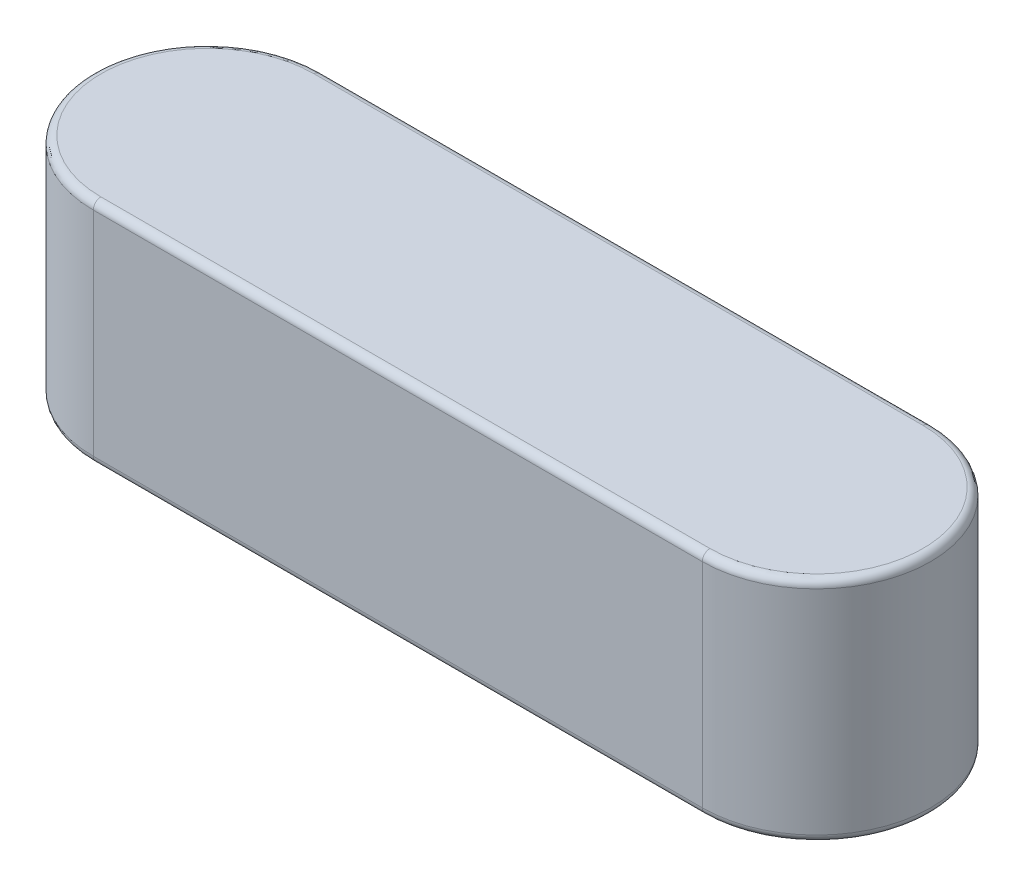
ISO-10303-21;
HEADER;
FILE_DESCRIPTION(('STEP AP214'),'2;1');
FILE_NAME('part.step','',(''),(''),'','','');
FILE_SCHEMA(('AUTOMOTIVE_DESIGN { 1 0 10303 214 1 1 1 1 }'));
ENDSEC;
DATA;
#1=APPLICATION_CONTEXT('core data for automotive mechanical design processes');
#2=APPLICATION_PROTOCOL_DEFINITION('international standard','automotive_design',2000,#1);
#3=PRODUCT_CONTEXT('',#1,'mechanical');
#4=PRODUCT('Part','Part','',(#3));
#5=PRODUCT_RELATED_PRODUCT_CATEGORY('part','',(#4));
#6=PRODUCT_DEFINITION_FORMATION('','',#4);
#7=PRODUCT_DEFINITION_CONTEXT('part definition',#1,'design');
#8=PRODUCT_DEFINITION('design','',#6,#7);
#9=PRODUCT_DEFINITION_SHAPE('','',#8);
#10=(LENGTH_UNIT() NAMED_UNIT(*) SI_UNIT(.MILLI.,.METRE.));
#11=(NAMED_UNIT(*) PLANE_ANGLE_UNIT() SI_UNIT($,.RADIAN.));
#12=(NAMED_UNIT(*) SI_UNIT($,.STERADIAN.) SOLID_ANGLE_UNIT());
#13=UNCERTAINTY_MEASURE_WITH_UNIT(LENGTH_MEASURE(1.E-05),#10,'distance_accuracy_value','');
#14=(GEOMETRIC_REPRESENTATION_CONTEXT(3) GLOBAL_UNCERTAINTY_ASSIGNED_CONTEXT((#13)) GLOBAL_UNIT_ASSIGNED_CONTEXT((#10,
#11,#12)) REPRESENTATION_CONTEXT('',''));
#15=CARTESIAN_POINT('',(0.,0.,0.));
#16=DIRECTION('',(0.,0.,1.));
#17=DIRECTION('',(1.,0.,0.));
#18=AXIS2_PLACEMENT_3D('',#15,#16,#17);
#19=CARTESIAN_POINT('',(0.,6.,0.));
#20=DIRECTION('',(0.,-1.,0.));
#21=DIRECTION('',(0.,0.,-1.));
#22=AXIS2_PLACEMENT_3D('',#19,#20,#21);
#23=CYLINDRICAL_SURFACE('',#22,3.);
#24=DIRECTION('',(0.,-1.,0.));
#25=VECTOR('',#24,1.);
#26=CARTESIAN_POINT('',(0.,6.,3.));
#27=LINE('',#26,#25);
#28=CARTESIAN_POINT('',(0.,5.8,3.));
#29=VERTEX_POINT('',#28);
#30=CARTESIAN_POINT('',(0.,0.2,3.));
#31=VERTEX_POINT('',#30);
#32=EDGE_CURVE('E130',#29,#31,#27,.T.);
#33=ORIENTED_EDGE('',*,*,#32,.F.);
#34=CARTESIAN_POINT('',(0.,5.8,0.));
#35=DIRECTION('',(0.,1.,0.));
#36=DIRECTION('',(0.,0.,1.));
#37=AXIS2_PLACEMENT_3D('',#34,#35,#36);
#38=CIRCLE('',#37,3.);
#39=CARTESIAN_POINT('',(0.,5.8,-3.));
#40=VERTEX_POINT('',#39);
#41=EDGE_CURVE('E115',#29,#40,#38,.F.);
#42=ORIENTED_EDGE('',*,*,#41,.T.);
#43=DIRECTION('',(0.,-1.,0.));
#44=VECTOR('',#43,1.);
#45=CARTESIAN_POINT('',(0.,6.,-3.));
#46=LINE('',#45,#44);
#47=CARTESIAN_POINT('',(0.,0.2,-3.));
#48=VERTEX_POINT('',#47);
#49=EDGE_CURVE('E181',#40,#48,#46,.T.);
#50=ORIENTED_EDGE('',*,*,#49,.T.);
#51=CARTESIAN_POINT('',(0.,0.2,0.));
#52=DIRECTION('',(0.,1.,0.));
#53=DIRECTION('',(0.,0.,1.));
#54=AXIS2_PLACEMENT_3D('',#51,#52,#53);
#55=CIRCLE('',#54,3.);
#56=EDGE_CURVE('E137',#48,#31,#55,.T.);
#57=ORIENTED_EDGE('',*,*,#56,.T.);
#58=EDGE_LOOP('',(#33,#42,#50,#57));
#59=FACE_BOUND('',#58,.T.);
#60=ADVANCED_FACE('F39',(#59),#23,.T.);
#61=CARTESIAN_POINT('',(0.,6.,3.));
#62=DIRECTION('',(0.,0.,-1.));
#63=DIRECTION('',(-1.,0.,0.));
#64=AXIS2_PLACEMENT_3D('',#61,#62,#63);
#65=PLANE('',#64);
#66=DIRECTION('',(0.,-1.,0.));
#67=VECTOR('',#66,1.);
#68=CARTESIAN_POINT('',(16.,6.,3.));
#69=LINE('',#68,#67);
#70=CARTESIAN_POINT('',(16.,5.8,3.));
#71=VERTEX_POINT('',#70);
#72=CARTESIAN_POINT('',(16.,0.2,3.));
#73=VERTEX_POINT('',#72);
#74=EDGE_CURVE('E215',#71,#73,#69,.T.);
#75=ORIENTED_EDGE('',*,*,#74,.F.);
#76=DIRECTION('',(1.,0.,0.));
#77=VECTOR('',#76,1.);
#78=CARTESIAN_POINT('',(0.,5.8,3.));
#79=LINE('',#78,#77);
#80=EDGE_CURVE('E11',#71,#29,#79,.F.);
#81=ORIENTED_EDGE('',*,*,#80,.T.);
#82=ORIENTED_EDGE('',*,*,#32,.T.);
#83=DIRECTION('',(1.,0.,0.));
#84=VECTOR('',#83,1.);
#85=CARTESIAN_POINT('',(0.,0.2,3.));
#86=LINE('',#85,#84);
#87=EDGE_CURVE('E49',#31,#73,#86,.T.);
#88=ORIENTED_EDGE('',*,*,#87,.T.);
#89=EDGE_LOOP('',(#75,#81,#82,#88));
#90=FACE_BOUND('',#89,.T.);
#91=ADVANCED_FACE('F213',(#90),#65,.F.);
#92=CARTESIAN_POINT('',(16.,6.,0.));
#93=DIRECTION('',(0.,-1.,0.));
#94=DIRECTION('',(0.,0.,-1.));
#95=AXIS2_PLACEMENT_3D('',#92,#93,#94);
#96=CYLINDRICAL_SURFACE('',#95,3.);
#97=DIRECTION('',(0.,-1.,0.));
#98=VECTOR('',#97,1.);
#99=CARTESIAN_POINT('',(16.,6.,-3.));
#100=LINE('',#99,#98);
#101=CARTESIAN_POINT('',(16.,5.8,-3.));
#102=VERTEX_POINT('',#101);
#103=CARTESIAN_POINT('',(16.,0.2,-3.));
#104=VERTEX_POINT('',#103);
#105=EDGE_CURVE('E218',#102,#104,#100,.T.);
#106=ORIENTED_EDGE('',*,*,#105,.F.);
#107=CARTESIAN_POINT('',(16.,5.8,0.));
#108=DIRECTION('',(0.,1.,0.));
#109=DIRECTION('',(0.,0.,1.));
#110=AXIS2_PLACEMENT_3D('',#107,#108,#109);
#111=CIRCLE('',#110,3.);
#112=EDGE_CURVE('E157',#102,#71,#111,.F.);
#113=ORIENTED_EDGE('',*,*,#112,.T.);
#114=ORIENTED_EDGE('',*,*,#74,.T.);
#115=CARTESIAN_POINT('',(16.,0.2,0.));
#116=DIRECTION('',(0.,1.,0.));
#117=DIRECTION('',(0.,0.,1.));
#118=AXIS2_PLACEMENT_3D('',#115,#116,#117);
#119=CIRCLE('',#118,3.);
#120=EDGE_CURVE('E154',#73,#104,#119,.T.);
#121=ORIENTED_EDGE('',*,*,#120,.T.);
#122=EDGE_LOOP('',(#106,#113,#114,#121));
#123=FACE_BOUND('',#122,.T.);
#124=ADVANCED_FACE('F237',(#123),#96,.T.);
#125=CARTESIAN_POINT('',(0.,6.,-3.));
#126=DIRECTION('',(0.,0.,1.));
#127=DIRECTION('',(1.,0.,0.));
#128=AXIS2_PLACEMENT_3D('',#125,#126,#127);
#129=PLANE('',#128);
#130=ORIENTED_EDGE('',*,*,#49,.F.);
#131=DIRECTION('',(-1.,0.,0.));
#132=VECTOR('',#131,1.);
#133=CARTESIAN_POINT('',(16.,5.8,-3.));
#134=LINE('',#133,#132);
#135=EDGE_CURVE('E151',#40,#102,#134,.F.);
#136=ORIENTED_EDGE('',*,*,#135,.T.);
#137=ORIENTED_EDGE('',*,*,#105,.T.);
#138=DIRECTION('',(-1.,0.,0.));
#139=VECTOR('',#138,1.);
#140=CARTESIAN_POINT('',(0.,0.2,-3.));
#141=LINE('',#140,#139);
#142=EDGE_CURVE('E148',#104,#48,#141,.T.);
#143=ORIENTED_EDGE('',*,*,#142,.T.);
#144=EDGE_LOOP('',(#130,#136,#137,#143));
#145=FACE_BOUND('',#144,.T.);
#146=ADVANCED_FACE('F232',(#145),#129,.F.);
#147=CARTESIAN_POINT('',(0.,6.,0.));
#148=DIRECTION('',(0.,1.,0.));
#149=DIRECTION('',(0.,0.,1.));
#150=AXIS2_PLACEMENT_3D('',#147,#148,#149);
#151=PLANE('',#150);
#152=DIRECTION('',(-1.,0.,0.));
#153=VECTOR('',#152,1.);
#154=CARTESIAN_POINT('',(0.,6.,-2.8));
#155=LINE('',#154,#153);
#156=CARTESIAN_POINT('',(16.,6.,-2.8));
#157=VERTEX_POINT('',#156);
#158=CARTESIAN_POINT('',(0.,6.,-2.8));
#159=VERTEX_POINT('',#158);
#160=EDGE_CURVE('E134',#157,#159,#155,.T.);
#161=ORIENTED_EDGE('',*,*,#160,.T.);
#162=CARTESIAN_POINT('',(0.,6.,0.));
#163=DIRECTION('',(0.,1.,0.));
#164=DIRECTION('',(0.,0.,1.));
#165=AXIS2_PLACEMENT_3D('',#162,#163,#164);
#166=CIRCLE('',#165,2.8);
#167=CARTESIAN_POINT('',(0.,6.,2.8));
#168=VERTEX_POINT('',#167);
#169=EDGE_CURVE('E113',#159,#168,#166,.T.);
#170=ORIENTED_EDGE('',*,*,#169,.T.);
#171=DIRECTION('',(1.,0.,0.));
#172=VECTOR('',#171,1.);
#173=CARTESIAN_POINT('',(16.,6.,2.8));
#174=LINE('',#173,#172);
#175=CARTESIAN_POINT('',(16.,6.,2.8));
#176=VERTEX_POINT('',#175);
#177=EDGE_CURVE('E122',#168,#176,#174,.T.);
#178=ORIENTED_EDGE('',*,*,#177,.T.);
#179=CARTESIAN_POINT('',(16.,6.,0.));
#180=DIRECTION('',(0.,1.,0.));
#181=DIRECTION('',(0.,0.,1.));
#182=AXIS2_PLACEMENT_3D('',#179,#180,#181);
#183=CIRCLE('',#182,2.8);
#184=EDGE_CURVE('E129',#176,#157,#183,.T.);
#185=ORIENTED_EDGE('',*,*,#184,.T.);
#186=EDGE_LOOP('',(#161,#170,#178,#185));
#187=FACE_BOUND('',#186,.T.);
#188=ADVANCED_FACE('F132',(#187),#151,.T.);
#189=CARTESIAN_POINT('',(0.,0.,0.));
#190=DIRECTION('',(0.,1.,0.));
#191=DIRECTION('',(0.,0.,1.));
#192=AXIS2_PLACEMENT_3D('',#189,#190,#191);
#193=PLANE('',#192);
#194=DIRECTION('',(1.,0.,0.));
#195=VECTOR('',#194,1.);
#196=CARTESIAN_POINT('',(0.,0.,2.8));
#197=LINE('',#196,#195);
#198=CARTESIAN_POINT('',(16.,0.,2.8));
#199=VERTEX_POINT('',#198);
#200=CARTESIAN_POINT('',(0.,0.,2.8));
#201=VERTEX_POINT('',#200);
#202=EDGE_CURVE('E160',#199,#201,#197,.F.);
#203=ORIENTED_EDGE('',*,*,#202,.T.);
#204=CARTESIAN_POINT('',(0.,0.,0.));
#205=DIRECTION('',(0.,1.,0.));
#206=DIRECTION('',(0.,0.,1.));
#207=AXIS2_PLACEMENT_3D('',#204,#205,#206);
#208=CIRCLE('',#207,2.8);
#209=CARTESIAN_POINT('',(0.,0.,-2.8));
#210=VERTEX_POINT('',#209);
#211=EDGE_CURVE('E168',#201,#210,#208,.F.);
#212=ORIENTED_EDGE('',*,*,#211,.T.);
#213=DIRECTION('',(-1.,0.,0.));
#214=VECTOR('',#213,1.);
#215=CARTESIAN_POINT('',(0.,0.,-2.8));
#216=LINE('',#215,#214);
#217=CARTESIAN_POINT('',(16.,0.,-2.8));
#218=VERTEX_POINT('',#217);
#219=EDGE_CURVE('E64',#210,#218,#216,.F.);
#220=ORIENTED_EDGE('',*,*,#219,.T.);
#221=CARTESIAN_POINT('',(16.,0.,0.));
#222=DIRECTION('',(0.,1.,0.));
#223=DIRECTION('',(0.,0.,1.));
#224=AXIS2_PLACEMENT_3D('',#221,#222,#223);
#225=CIRCLE('',#224,2.8);
#226=EDGE_CURVE('E163',#218,#199,#225,.F.);
#227=ORIENTED_EDGE('',*,*,#226,.T.);
#228=EDGE_LOOP('',(#203,#212,#220,#227));
#229=FACE_BOUND('',#228,.T.);
#230=ADVANCED_FACE('F201',(#229),#193,.F.);
#231=CARTESIAN_POINT('',(16.,5.8,0.));
#232=DIRECTION('',(0.,1.,0.));
#233=DIRECTION('',(0.,0.,1.));
#234=AXIS2_PLACEMENT_3D('',#231,#232,#233);
#235=TOROIDAL_SURFACE('',#234,2.8,0.2);
#236=CARTESIAN_POINT('',(16.,5.8,2.8));
#237=DIRECTION('',(-1.,0.,0.));
#238=DIRECTION('',(0.,0.,1.));
#239=AXIS2_PLACEMENT_3D('',#236,#237,#238);
#240=CIRCLE('',#239,0.2);
#241=EDGE_CURVE('E125',#71,#176,#240,.T.);
#242=ORIENTED_EDGE('',*,*,#241,.F.);
#243=ORIENTED_EDGE('',*,*,#112,.F.);
#244=CARTESIAN_POINT('',(16.,5.8,-2.8));
#245=DIRECTION('',(-1.,0.,0.));
#246=DIRECTION('',(0.,0.,1.));
#247=AXIS2_PLACEMENT_3D('',#244,#245,#246);
#248=CIRCLE('',#247,0.2);
#249=EDGE_CURVE('E177',#157,#102,#248,.T.);
#250=ORIENTED_EDGE('',*,*,#249,.F.);
#251=ORIENTED_EDGE('',*,*,#184,.F.);
#252=EDGE_LOOP('',(#242,#243,#250,#251));
#253=FACE_BOUND('',#252,.T.);
#254=ADVANCED_FACE('F225',(#253),#235,.T.);
#255=CARTESIAN_POINT('',(0.,5.8,-2.8));
#256=DIRECTION('',(1.,0.,0.));
#257=DIRECTION('',(0.,0.,-1.));
#258=AXIS2_PLACEMENT_3D('',#255,#256,#257);
#259=CYLINDRICAL_SURFACE('',#258,0.2);
#260=ORIENTED_EDGE('',*,*,#249,.T.);
#261=ORIENTED_EDGE('',*,*,#135,.F.);
#262=CARTESIAN_POINT('',(0.,5.8,-2.8));
#263=DIRECTION('',(-1.,0.,0.));
#264=DIRECTION('',(0.,0.,1.));
#265=AXIS2_PLACEMENT_3D('',#262,#263,#264);
#266=CIRCLE('',#265,0.2);
#267=EDGE_CURVE('E119',#159,#40,#266,.T.);
#268=ORIENTED_EDGE('',*,*,#267,.F.);
#269=ORIENTED_EDGE('',*,*,#160,.F.);
#270=EDGE_LOOP('',(#260,#261,#268,#269));
#271=FACE_BOUND('',#270,.T.);
#272=ADVANCED_FACE('F228',(#271),#259,.T.);
#273=CARTESIAN_POINT('',(0.,5.8,2.8));
#274=DIRECTION('',(-1.,0.,0.));
#275=DIRECTION('',(0.,0.,1.));
#276=AXIS2_PLACEMENT_3D('',#273,#274,#275);
#277=CYLINDRICAL_SURFACE('',#276,0.2);
#278=ORIENTED_EDGE('',*,*,#241,.T.);
#279=ORIENTED_EDGE('',*,*,#177,.F.);
#280=CARTESIAN_POINT('',(0.,5.8,2.8));
#281=DIRECTION('',(-1.,0.,0.));
#282=DIRECTION('',(0.,-1.,0.));
#283=AXIS2_PLACEMENT_3D('',#280,#281,#282);
#284=CIRCLE('',#283,0.2);
#285=EDGE_CURVE('E109',#29,#168,#284,.T.);
#286=ORIENTED_EDGE('',*,*,#285,.F.);
#287=ORIENTED_EDGE('',*,*,#80,.F.);
#288=EDGE_LOOP('',(#278,#279,#286,#287));
#289=FACE_BOUND('',#288,.T.);
#290=ADVANCED_FACE('F123',(#289),#277,.T.);
#291=CARTESIAN_POINT('',(0.,5.8,0.));
#292=DIRECTION('',(0.,1.,0.));
#293=DIRECTION('',(0.,0.,1.));
#294=AXIS2_PLACEMENT_3D('',#291,#292,#293);
#295=TOROIDAL_SURFACE('',#294,2.8,0.2);
#296=ORIENTED_EDGE('',*,*,#267,.T.);
#297=ORIENTED_EDGE('',*,*,#41,.F.);
#298=ORIENTED_EDGE('',*,*,#285,.T.);
#299=ORIENTED_EDGE('',*,*,#169,.F.);
#300=EDGE_LOOP('',(#296,#297,#298,#299));
#301=FACE_BOUND('',#300,.T.);
#302=ADVANCED_FACE('F111',(#301),#295,.T.);
#303=CARTESIAN_POINT('',(16.,0.2,0.));
#304=DIRECTION('',(0.,1.,0.));
#305=DIRECTION('',(0.,0.,1.));
#306=AXIS2_PLACEMENT_3D('',#303,#304,#305);
#307=TOROIDAL_SURFACE('',#306,2.8,0.2);
#308=CARTESIAN_POINT('',(16.,0.2,2.8));
#309=DIRECTION('',(-1.,0.,0.));
#310=DIRECTION('',(0.,0.,1.));
#311=AXIS2_PLACEMENT_3D('',#308,#309,#310);
#312=CIRCLE('',#311,0.2);
#313=EDGE_CURVE('E186',#199,#73,#312,.T.);
#314=ORIENTED_EDGE('',*,*,#313,.F.);
#315=ORIENTED_EDGE('',*,*,#226,.F.);
#316=CARTESIAN_POINT('',(16.,0.2,-2.8));
#317=DIRECTION('',(-1.,0.,0.));
#318=DIRECTION('',(0.,0.,1.));
#319=AXIS2_PLACEMENT_3D('',#316,#317,#318);
#320=CIRCLE('',#319,0.2);
#321=EDGE_CURVE('E43',#104,#218,#320,.T.);
#322=ORIENTED_EDGE('',*,*,#321,.F.);
#323=ORIENTED_EDGE('',*,*,#120,.F.);
#324=EDGE_LOOP('',(#314,#315,#322,#323));
#325=FACE_BOUND('',#324,.T.);
#326=ADVANCED_FACE('F41',(#325),#307,.T.);
#327=CARTESIAN_POINT('',(0.,0.2,-2.8));
#328=DIRECTION('',(-1.,0.,0.));
#329=DIRECTION('',(0.,0.,1.));
#330=AXIS2_PLACEMENT_3D('',#327,#328,#329);
#331=CYLINDRICAL_SURFACE('',#330,0.2);
#332=ORIENTED_EDGE('',*,*,#321,.T.);
#333=ORIENTED_EDGE('',*,*,#219,.F.);
#334=CARTESIAN_POINT('',(0.,0.2,-2.8));
#335=DIRECTION('',(-1.,0.,0.));
#336=DIRECTION('',(0.,-1.,0.));
#337=AXIS2_PLACEMENT_3D('',#334,#335,#336);
#338=CIRCLE('',#337,0.2);
#339=EDGE_CURVE('E57',#48,#210,#338,.T.);
#340=ORIENTED_EDGE('',*,*,#339,.F.);
#341=ORIENTED_EDGE('',*,*,#142,.F.);
#342=EDGE_LOOP('',(#332,#333,#340,#341));
#343=FACE_BOUND('',#342,.T.);
#344=ADVANCED_FACE('F198',(#343),#331,.T.);
#345=CARTESIAN_POINT('',(0.,0.2,2.8));
#346=DIRECTION('',(1.,0.,0.));
#347=DIRECTION('',(0.,0.,-1.));
#348=AXIS2_PLACEMENT_3D('',#345,#346,#347);
#349=CYLINDRICAL_SURFACE('',#348,0.2);
#350=ORIENTED_EDGE('',*,*,#313,.T.);
#351=ORIENTED_EDGE('',*,*,#87,.F.);
#352=CARTESIAN_POINT('',(0.,0.2,2.8));
#353=DIRECTION('',(-1.,0.,0.));
#354=DIRECTION('',(0.,0.,1.));
#355=AXIS2_PLACEMENT_3D('',#352,#353,#354);
#356=CIRCLE('',#355,0.2);
#357=EDGE_CURVE('E182',#201,#31,#356,.T.);
#358=ORIENTED_EDGE('',*,*,#357,.F.);
#359=ORIENTED_EDGE('',*,*,#202,.F.);
#360=EDGE_LOOP('',(#350,#351,#358,#359));
#361=FACE_BOUND('',#360,.T.);
#362=ADVANCED_FACE('F204',(#361),#349,.T.);
#363=CARTESIAN_POINT('',(0.,0.2,0.));
#364=DIRECTION('',(0.,1.,0.));
#365=DIRECTION('',(0.,0.,1.));
#366=AXIS2_PLACEMENT_3D('',#363,#364,#365);
#367=TOROIDAL_SURFACE('',#366,2.8,0.2);
#368=ORIENTED_EDGE('',*,*,#339,.T.);
#369=ORIENTED_EDGE('',*,*,#211,.F.);
#370=ORIENTED_EDGE('',*,*,#357,.T.);
#371=ORIENTED_EDGE('',*,*,#56,.F.);
#372=EDGE_LOOP('',(#368,#369,#370,#371));
#373=FACE_BOUND('',#372,.T.);
#374=ADVANCED_FACE('F203',(#373),#367,.T.);
#375=CLOSED_SHELL('',(#60,#91,#124,#146,#188,#230,#254,#272,#290,#302,#326,#344,#362,#374));
#376=MANIFOLD_SOLID_BREP('B2',#375);
#377=ADVANCED_BREP_SHAPE_REPRESENTATION('',(#18,#376),#14);
#378=SHAPE_DEFINITION_REPRESENTATION(#9,#377);
ENDSEC;
END-ISO-10303-21;
